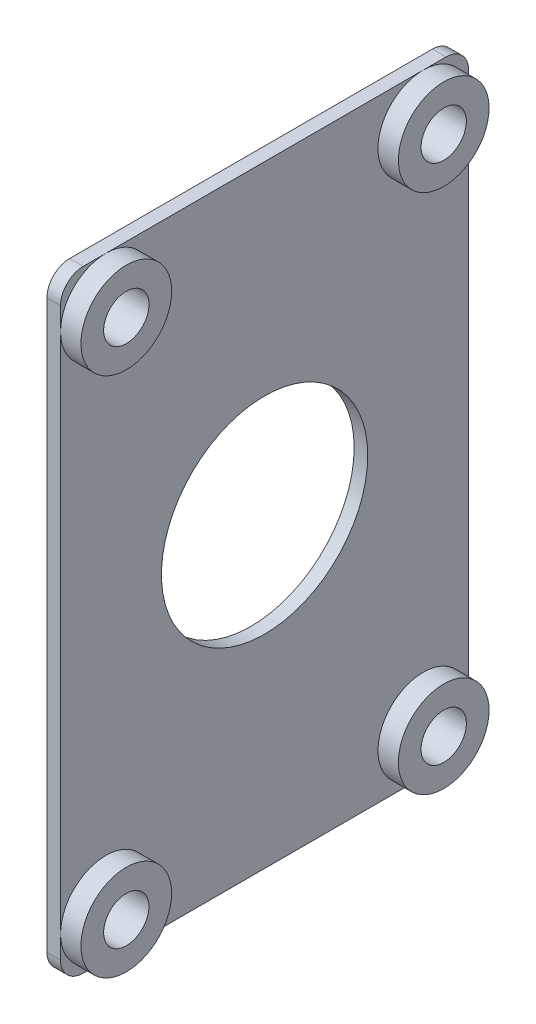
ISO-10303-21;
HEADER;
FILE_DESCRIPTION(('STEP AP214'),'2;1');
FILE_NAME('part.step','',(''),(''),'','','');
FILE_SCHEMA(('AUTOMOTIVE_DESIGN { 1 0 10303 214 1 1 1 1 }'));
ENDSEC;
DATA;
#1=APPLICATION_CONTEXT('core data for automotive mechanical design processes');
#2=APPLICATION_PROTOCOL_DEFINITION('international standard','automotive_design',2000,#1);
#3=PRODUCT_CONTEXT('',#1,'mechanical');
#4=PRODUCT('Part','Part','',(#3));
#5=PRODUCT_RELATED_PRODUCT_CATEGORY('part','',(#4));
#6=PRODUCT_DEFINITION_FORMATION('','',#4);
#7=PRODUCT_DEFINITION_CONTEXT('part definition',#1,'design');
#8=PRODUCT_DEFINITION('design','',#6,#7);
#9=PRODUCT_DEFINITION_SHAPE('','',#8);
#10=(LENGTH_UNIT() NAMED_UNIT(*) SI_UNIT(.MILLI.,.METRE.));
#11=(NAMED_UNIT(*) PLANE_ANGLE_UNIT() SI_UNIT($,.RADIAN.));
#12=(NAMED_UNIT(*) SI_UNIT($,.STERADIAN.) SOLID_ANGLE_UNIT());
#13=UNCERTAINTY_MEASURE_WITH_UNIT(LENGTH_MEASURE(1.E-05),#10,'distance_accuracy_value','');
#14=(GEOMETRIC_REPRESENTATION_CONTEXT(3) GLOBAL_UNCERTAINTY_ASSIGNED_CONTEXT((#13)) GLOBAL_UNIT_ASSIGNED_CONTEXT((#10,
#11,#12)) REPRESENTATION_CONTEXT('',''));
#15=CARTESIAN_POINT('',(0.,0.,0.));
#16=DIRECTION('',(0.,0.,1.));
#17=DIRECTION('',(1.,0.,0.));
#18=AXIS2_PLACEMENT_3D('',#15,#16,#17);
#19=CARTESIAN_POINT('',(-46.75,-23.,149.));
#20=DIRECTION('',(1.,0.,0.));
#21=DIRECTION('',(0.,0.,-1.));
#22=AXIS2_PLACEMENT_3D('',#19,#20,#21);
#23=CYLINDRICAL_SURFACE('',#22,4.);
#24=CARTESIAN_POINT('',(-43.75,-23.,149.));
#25=DIRECTION('',(1.,0.,0.));
#26=DIRECTION('',(0.,0.,-1.));
#27=AXIS2_PLACEMENT_3D('',#24,#25,#26);
#28=CIRCLE('',#27,4.);
#29=CARTESIAN_POINT('',(-43.75,-23.,145.));
#30=VERTEX_POINT('',#29);
#31=EDGE_CURVE('E122',#30,#30,#28,.T.);
#32=ORIENTED_EDGE('',*,*,#31,.F.);
#33=EDGE_LOOP('',(#32));
#34=FACE_BOUND('',#33,.T.);
#35=CARTESIAN_POINT('',(-45.55,-23.,149.));
#36=DIRECTION('',(1.,0.,0.));
#37=DIRECTION('',(0.,0.,-1.));
#38=AXIS2_PLACEMENT_3D('',#35,#36,#37);
#39=CIRCLE('',#38,4.);
#40=CARTESIAN_POINT('',(-45.55,-23.,145.));
#41=VERTEX_POINT('',#40);
#42=CARTESIAN_POINT('',(-45.55,-27.,149.));
#43=VERTEX_POINT('',#42);
#44=EDGE_CURVE('E221',#41,#43,#39,.F.);
#45=ORIENTED_EDGE('',*,*,#44,.F.);
#46=CARTESIAN_POINT('',(-45.55,-23.,149.));
#47=DIRECTION('',(1.,0.,0.));
#48=DIRECTION('',(0.,0.,-1.));
#49=AXIS2_PLACEMENT_3D('',#46,#47,#48);
#50=CIRCLE('',#49,4.);
#51=EDGE_CURVE('E214',#43,#41,#50,.F.);
#52=ORIENTED_EDGE('',*,*,#51,.F.);
#53=EDGE_LOOP('',(#45,#52));
#54=FACE_BOUND('',#53,.T.);
#55=ADVANCED_FACE('F16',(#34,#54),#23,.T.);
#56=CARTESIAN_POINT('',(-46.75,23.,149.));
#57=DIRECTION('',(1.,0.,0.));
#58=DIRECTION('',(0.,0.,-1.));
#59=AXIS2_PLACEMENT_3D('',#56,#57,#58);
#60=CYLINDRICAL_SURFACE('',#59,4.);
#61=CARTESIAN_POINT('',(-43.75,23.,149.));
#62=DIRECTION('',(1.,0.,0.));
#63=DIRECTION('',(0.,0.,-1.));
#64=AXIS2_PLACEMENT_3D('',#61,#62,#63);
#65=CIRCLE('',#64,4.);
#66=CARTESIAN_POINT('',(-43.75,23.,145.));
#67=VERTEX_POINT('',#66);
#68=EDGE_CURVE('E211',#67,#67,#65,.T.);
#69=ORIENTED_EDGE('',*,*,#68,.F.);
#70=EDGE_LOOP('',(#69));
#71=FACE_BOUND('',#70,.T.);
#72=CARTESIAN_POINT('',(-45.55,23.,149.));
#73=DIRECTION('',(1.,0.,0.));
#74=DIRECTION('',(0.,0.,-1.));
#75=AXIS2_PLACEMENT_3D('',#72,#73,#74);
#76=CIRCLE('',#75,4.);
#77=CARTESIAN_POINT('',(-45.55,23.,145.));
#78=VERTEX_POINT('',#77);
#79=CARTESIAN_POINT('',(-45.55,27.,149.));
#80=VERTEX_POINT('',#79);
#81=EDGE_CURVE('E111',#78,#80,#76,.F.);
#82=ORIENTED_EDGE('',*,*,#81,.F.);
#83=CARTESIAN_POINT('',(-45.55,23.,149.));
#84=DIRECTION('',(1.,0.,0.));
#85=DIRECTION('',(0.,0.,-1.));
#86=AXIS2_PLACEMENT_3D('',#83,#84,#85);
#87=CIRCLE('',#86,4.);
#88=EDGE_CURVE('E19',#80,#78,#87,.F.);
#89=ORIENTED_EDGE('',*,*,#88,.F.);
#90=EDGE_LOOP('',(#82,#89));
#91=FACE_BOUND('',#90,.T.);
#92=ADVANCED_FACE('F124',(#71,#91),#60,.T.);
#93=CARTESIAN_POINT('',(-46.75,-23.,177.));
#94=DIRECTION('',(1.,0.,0.));
#95=DIRECTION('',(0.,0.,-1.));
#96=AXIS2_PLACEMENT_3D('',#93,#94,#95);
#97=CYLINDRICAL_SURFACE('',#96,4.);
#98=CARTESIAN_POINT('',(-43.75,-23.,177.));
#99=DIRECTION('',(1.,0.,0.));
#100=DIRECTION('',(0.,0.,-1.));
#101=AXIS2_PLACEMENT_3D('',#98,#99,#100);
#102=CIRCLE('',#101,4.);
#103=CARTESIAN_POINT('',(-43.75,-23.,173.));
#104=VERTEX_POINT('',#103);
#105=EDGE_CURVE('E208',#104,#104,#102,.T.);
#106=ORIENTED_EDGE('',*,*,#105,.F.);
#107=EDGE_LOOP('',(#106));
#108=FACE_BOUND('',#107,.T.);
#109=CARTESIAN_POINT('',(-45.55,-23.,177.));
#110=DIRECTION('',(1.,0.,0.));
#111=DIRECTION('',(0.,0.,-1.));
#112=AXIS2_PLACEMENT_3D('',#109,#110,#111);
#113=CIRCLE('',#112,4.);
#114=CARTESIAN_POINT('',(-45.55,-27.,177.));
#115=VERTEX_POINT('',#114);
#116=CARTESIAN_POINT('',(-45.55,-23.,181.));
#117=VERTEX_POINT('',#116);
#118=EDGE_CURVE('E223',#115,#117,#113,.F.);
#119=ORIENTED_EDGE('',*,*,#118,.F.);
#120=CARTESIAN_POINT('',(-45.55,-23.,177.));
#121=DIRECTION('',(1.,0.,0.));
#122=DIRECTION('',(0.,0.,-1.));
#123=AXIS2_PLACEMENT_3D('',#120,#121,#122);
#124=CIRCLE('',#123,4.);
#125=EDGE_CURVE('E216',#117,#115,#124,.F.);
#126=ORIENTED_EDGE('',*,*,#125,.F.);
#127=EDGE_LOOP('',(#119,#126));
#128=FACE_BOUND('',#127,.T.);
#129=ADVANCED_FACE('F355',(#108,#128),#97,.T.);
#130=CARTESIAN_POINT('',(-46.75,23.,177.));
#131=DIRECTION('',(1.,0.,0.));
#132=DIRECTION('',(0.,0.,-1.));
#133=AXIS2_PLACEMENT_3D('',#130,#131,#132);
#134=CYLINDRICAL_SURFACE('',#133,4.);
#135=CARTESIAN_POINT('',(-43.75,23.,177.));
#136=DIRECTION('',(1.,0.,0.));
#137=DIRECTION('',(0.,0.,-1.));
#138=AXIS2_PLACEMENT_3D('',#135,#136,#137);
#139=CIRCLE('',#138,4.);
#140=CARTESIAN_POINT('',(-43.75,23.,173.));
#141=VERTEX_POINT('',#140);
#142=EDGE_CURVE('E205',#141,#141,#139,.T.);
#143=ORIENTED_EDGE('',*,*,#142,.F.);
#144=EDGE_LOOP('',(#143));
#145=FACE_BOUND('',#144,.T.);
#146=CARTESIAN_POINT('',(-45.55,23.,177.));
#147=DIRECTION('',(1.,0.,0.));
#148=DIRECTION('',(0.,0.,-1.));
#149=AXIS2_PLACEMENT_3D('',#146,#147,#148);
#150=CIRCLE('',#149,4.);
#151=CARTESIAN_POINT('',(-45.55,23.,181.));
#152=VERTEX_POINT('',#151);
#153=CARTESIAN_POINT('',(-45.55,27.,177.));
#154=VERTEX_POINT('',#153);
#155=EDGE_CURVE('E104',#152,#154,#150,.F.);
#156=ORIENTED_EDGE('',*,*,#155,.F.);
#157=CARTESIAN_POINT('',(-45.55,23.,177.));
#158=DIRECTION('',(1.,0.,0.));
#159=DIRECTION('',(0.,0.,-1.));
#160=AXIS2_PLACEMENT_3D('',#157,#158,#159);
#161=CIRCLE('',#160,4.);
#162=EDGE_CURVE('E121',#154,#152,#161,.F.);
#163=ORIENTED_EDGE('',*,*,#162,.F.);
#164=EDGE_LOOP('',(#156,#163));
#165=FACE_BOUND('',#164,.T.);
#166=ADVANCED_FACE('F352',(#145,#165),#134,.T.);
#167=CARTESIAN_POINT('',(-45.55,0.,163.));
#168=DIRECTION('',(1.,0.,0.));
#169=DIRECTION('',(0.,0.,-1.));
#170=AXIS2_PLACEMENT_3D('',#167,#168,#169);
#171=PLANE('',#170);
#172=CARTESIAN_POINT('',(-45.55,25.,147.));
#173=DIRECTION('',(1.,0.,0.));
#174=DIRECTION('',(0.,0.,-1.));
#175=AXIS2_PLACEMENT_3D('',#172,#173,#174);
#176=CIRCLE('',#175,2.);
#177=CARTESIAN_POINT('',(-45.55,27.,147.));
#178=VERTEX_POINT('',#177);
#179=CARTESIAN_POINT('',(-45.55,25.,145.));
#180=VERTEX_POINT('',#179);
#181=EDGE_CURVE('E138',#178,#180,#176,.F.);
#182=ORIENTED_EDGE('',*,*,#181,.F.);
#183=DIRECTION('',(0.,0.,-1.));
#184=VECTOR('',#183,1.);
#185=CARTESIAN_POINT('',(-45.55,27.,145.));
#186=LINE('',#185,#184);
#187=EDGE_CURVE('E133',#178,#80,#186,.F.);
#188=ORIENTED_EDGE('',*,*,#187,.T.);
#189=ORIENTED_EDGE('',*,*,#88,.T.);
#190=DIRECTION('',(0.,1.,0.));
#191=VECTOR('',#190,1.);
#192=CARTESIAN_POINT('',(-45.55,-27.,145.));
#193=LINE('',#192,#191);
#194=EDGE_CURVE('E145',#78,#180,#193,.T.);
#195=ORIENTED_EDGE('',*,*,#194,.T.);
#196=EDGE_LOOP('',(#182,#188,#189,#195));
#197=FACE_BOUND('',#196,.T.);
#198=ADVANCED_FACE('F137',(#197),#171,.T.);
#199=CARTESIAN_POINT('',(-45.55,0.,163.));
#200=DIRECTION('',(1.,0.,0.));
#201=DIRECTION('',(0.,0.,-1.));
#202=AXIS2_PLACEMENT_3D('',#199,#200,#201);
#203=PLANE('',#202);
#204=CARTESIAN_POINT('',(-45.55,25.,179.));
#205=DIRECTION('',(1.,0.,0.));
#206=DIRECTION('',(0.,0.,-1.));
#207=AXIS2_PLACEMENT_3D('',#204,#205,#206);
#208=CIRCLE('',#207,2.);
#209=CARTESIAN_POINT('',(-45.55,25.,181.));
#210=VERTEX_POINT('',#209);
#211=CARTESIAN_POINT('',(-45.55,27.,179.));
#212=VERTEX_POINT('',#211);
#213=EDGE_CURVE('E199',#210,#212,#208,.F.);
#214=ORIENTED_EDGE('',*,*,#213,.F.);
#215=DIRECTION('',(0.,1.,0.));
#216=VECTOR('',#215,1.);
#217=CARTESIAN_POINT('',(-45.55,27.,181.));
#218=LINE('',#217,#216);
#219=EDGE_CURVE('E243',#210,#152,#218,.F.);
#220=ORIENTED_EDGE('',*,*,#219,.T.);
#221=ORIENTED_EDGE('',*,*,#155,.T.);
#222=DIRECTION('',(0.,0.,-1.));
#223=VECTOR('',#222,1.);
#224=CARTESIAN_POINT('',(-45.55,27.,145.));
#225=LINE('',#224,#223);
#226=EDGE_CURVE('E135',#154,#212,#225,.F.);
#227=ORIENTED_EDGE('',*,*,#226,.T.);
#228=EDGE_LOOP('',(#214,#220,#221,#227));
#229=FACE_BOUND('',#228,.T.);
#230=ADVANCED_FACE('F248',(#229),#203,.T.);
#231=CARTESIAN_POINT('',(-45.55,0.,163.));
#232=DIRECTION('',(1.,0.,0.));
#233=DIRECTION('',(0.,0.,-1.));
#234=AXIS2_PLACEMENT_3D('',#231,#232,#233);
#235=PLANE('',#234);
#236=DIRECTION('',(0.,1.,0.));
#237=VECTOR('',#236,1.);
#238=CARTESIAN_POINT('',(-45.55,27.,181.));
#239=LINE('',#238,#237);
#240=CARTESIAN_POINT('',(-45.55,-25.,181.));
#241=VERTEX_POINT('',#240);
#242=EDGE_CURVE('E198',#117,#241,#239,.F.);
#243=ORIENTED_EDGE('',*,*,#242,.T.);
#244=CARTESIAN_POINT('',(-45.55,-25.,179.));
#245=DIRECTION('',(1.,0.,0.));
#246=DIRECTION('',(0.,0.,-1.));
#247=AXIS2_PLACEMENT_3D('',#244,#245,#246);
#248=CIRCLE('',#247,2.);
#249=CARTESIAN_POINT('',(-45.55,-27.,179.));
#250=VERTEX_POINT('',#249);
#251=EDGE_CURVE('E195',#250,#241,#248,.F.);
#252=ORIENTED_EDGE('',*,*,#251,.F.);
#253=DIRECTION('',(0.,0.,1.));
#254=VECTOR('',#253,1.);
#255=CARTESIAN_POINT('',(-45.55,-27.,181.));
#256=LINE('',#255,#254);
#257=EDGE_CURVE('E232',#250,#115,#256,.F.);
#258=ORIENTED_EDGE('',*,*,#257,.T.);
#259=ORIENTED_EDGE('',*,*,#118,.T.);
#260=EDGE_LOOP('',(#243,#252,#258,#259));
#261=FACE_BOUND('',#260,.T.);
#262=ADVANCED_FACE('F230',(#261),#235,.T.);
#263=CARTESIAN_POINT('',(-45.55,0.,163.));
#264=DIRECTION('',(1.,0.,0.));
#265=DIRECTION('',(0.,0.,-1.));
#266=AXIS2_PLACEMENT_3D('',#263,#264,#265);
#267=PLANE('',#266);
#268=ORIENTED_EDGE('',*,*,#44,.T.);
#269=DIRECTION('',(0.,0.,1.));
#270=VECTOR('',#269,1.);
#271=CARTESIAN_POINT('',(-45.55,-27.,181.));
#272=LINE('',#271,#270);
#273=CARTESIAN_POINT('',(-45.55,-27.,147.));
#274=VERTEX_POINT('',#273);
#275=EDGE_CURVE('E261',#43,#274,#272,.F.);
#276=ORIENTED_EDGE('',*,*,#275,.T.);
#277=CARTESIAN_POINT('',(-45.55,-25.,147.));
#278=DIRECTION('',(1.,0.,0.));
#279=DIRECTION('',(0.,0.,-1.));
#280=AXIS2_PLACEMENT_3D('',#277,#278,#279);
#281=CIRCLE('',#280,2.);
#282=CARTESIAN_POINT('',(-45.55,-25.,145.));
#283=VERTEX_POINT('',#282);
#284=EDGE_CURVE('E203',#283,#274,#281,.F.);
#285=ORIENTED_EDGE('',*,*,#284,.F.);
#286=DIRECTION('',(0.,1.,0.));
#287=VECTOR('',#286,1.);
#288=CARTESIAN_POINT('',(-45.55,-27.,145.));
#289=LINE('',#288,#287);
#290=EDGE_CURVE('E148',#283,#41,#289,.T.);
#291=ORIENTED_EDGE('',*,*,#290,.T.);
#292=EDGE_LOOP('',(#268,#276,#285,#291));
#293=FACE_BOUND('',#292,.T.);
#294=ADVANCED_FACE('F335',(#293),#267,.T.);
#295=CARTESIAN_POINT('',(-43.75,-23.,149.));
#296=DIRECTION('',(1.,0.,0.));
#297=DIRECTION('',(0.,0.,-1.));
#298=AXIS2_PLACEMENT_3D('',#295,#296,#297);
#299=PLANE('',#298);
#300=CARTESIAN_POINT('',(-43.75,-23.,149.));
#301=DIRECTION('',(1.,0.,0.));
#302=DIRECTION('',(0.,0.,-1.));
#303=AXIS2_PLACEMENT_3D('',#300,#301,#302);
#304=CIRCLE('',#303,2.);
#305=CARTESIAN_POINT('',(-43.75,-23.,147.));
#306=VERTEX_POINT('',#305);
#307=EDGE_CURVE('E191',#306,#306,#304,.F.);
#308=ORIENTED_EDGE('',*,*,#307,.T.);
#309=EDGE_LOOP('',(#308));
#310=FACE_BOUND('',#309,.T.);
#311=ORIENTED_EDGE('',*,*,#31,.T.);
#312=EDGE_LOOP('',(#311));
#313=FACE_BOUND('',#312,.T.);
#314=ADVANCED_FACE('F337',(#310,#313),#299,.T.);
#315=CARTESIAN_POINT('',(-45.55,0.,163.));
#316=DIRECTION('',(1.,0.,0.));
#317=DIRECTION('',(0.,0.,-1.));
#318=AXIS2_PLACEMENT_3D('',#315,#316,#317);
#319=PLANE('',#318);
#320=CARTESIAN_POINT('',(-45.55,0.,163.));
#321=DIRECTION('',(1.,0.,0.));
#322=DIRECTION('',(0.,0.,-1.));
#323=AXIS2_PLACEMENT_3D('',#320,#321,#322);
#324=CIRCLE('',#323,9.1);
#325=CARTESIAN_POINT('',(-45.55,0.,153.9));
#326=VERTEX_POINT('',#325);
#327=EDGE_CURVE('E188',#326,#326,#324,.F.);
#328=ORIENTED_EDGE('',*,*,#327,.T.);
#329=EDGE_LOOP('',(#328));
#330=FACE_BOUND('',#329,.T.);
#331=DIRECTION('',(0.,0.,1.));
#332=VECTOR('',#331,1.);
#333=CARTESIAN_POINT('',(-45.55,-27.,181.));
#334=LINE('',#333,#332);
#335=EDGE_CURVE('E264',#115,#43,#334,.F.);
#336=ORIENTED_EDGE('',*,*,#335,.T.);
#337=ORIENTED_EDGE('',*,*,#51,.T.);
#338=DIRECTION('',(0.,1.,0.));
#339=VECTOR('',#338,1.);
#340=CARTESIAN_POINT('',(-45.55,-27.,145.));
#341=LINE('',#340,#339);
#342=EDGE_CURVE('E118',#41,#78,#341,.T.);
#343=ORIENTED_EDGE('',*,*,#342,.T.);
#344=ORIENTED_EDGE('',*,*,#81,.T.);
#345=DIRECTION('',(0.,0.,-1.));
#346=VECTOR('',#345,1.);
#347=CARTESIAN_POINT('',(-45.55,27.,145.));
#348=LINE('',#347,#346);
#349=EDGE_CURVE('E116',#80,#154,#348,.F.);
#350=ORIENTED_EDGE('',*,*,#349,.T.);
#351=ORIENTED_EDGE('',*,*,#162,.T.);
#352=DIRECTION('',(0.,1.,0.));
#353=VECTOR('',#352,1.);
#354=CARTESIAN_POINT('',(-45.55,27.,181.));
#355=LINE('',#354,#353);
#356=EDGE_CURVE('E240',#152,#117,#355,.F.);
#357=ORIENTED_EDGE('',*,*,#356,.T.);
#358=ORIENTED_EDGE('',*,*,#125,.T.);
#359=EDGE_LOOP('',(#336,#337,#343,#344,#350,#351,#357,#358));
#360=FACE_BOUND('',#359,.T.);
#361=ADVANCED_FACE('F114',(#330,#360),#319,.T.);
#362=CARTESIAN_POINT('',(-43.75,23.,149.));
#363=DIRECTION('',(1.,0.,0.));
#364=DIRECTION('',(0.,0.,-1.));
#365=AXIS2_PLACEMENT_3D('',#362,#363,#364);
#366=PLANE('',#365);
#367=CARTESIAN_POINT('',(-43.75,23.,149.));
#368=DIRECTION('',(1.,0.,0.));
#369=DIRECTION('',(0.,0.,-1.));
#370=AXIS2_PLACEMENT_3D('',#367,#368,#369);
#371=CIRCLE('',#370,2.);
#372=CARTESIAN_POINT('',(-43.75,23.,147.));
#373=VERTEX_POINT('',#372);
#374=EDGE_CURVE('E185',#373,#373,#371,.F.);
#375=ORIENTED_EDGE('',*,*,#374,.T.);
#376=EDGE_LOOP('',(#375));
#377=FACE_BOUND('',#376,.T.);
#378=ORIENTED_EDGE('',*,*,#68,.T.);
#379=EDGE_LOOP('',(#378));
#380=FACE_BOUND('',#379,.T.);
#381=ADVANCED_FACE('F367',(#377,#380),#366,.T.);
#382=CARTESIAN_POINT('',(-43.75,-23.,177.));
#383=DIRECTION('',(1.,0.,0.));
#384=DIRECTION('',(0.,0.,-1.));
#385=AXIS2_PLACEMENT_3D('',#382,#383,#384);
#386=PLANE('',#385);
#387=CARTESIAN_POINT('',(-43.75,-23.,177.));
#388=DIRECTION('',(1.,0.,0.));
#389=DIRECTION('',(0.,0.,-1.));
#390=AXIS2_PLACEMENT_3D('',#387,#388,#389);
#391=CIRCLE('',#390,2.);
#392=CARTESIAN_POINT('',(-43.75,-23.,175.));
#393=VERTEX_POINT('',#392);
#394=EDGE_CURVE('E182',#393,#393,#391,.F.);
#395=ORIENTED_EDGE('',*,*,#394,.T.);
#396=EDGE_LOOP('',(#395));
#397=FACE_BOUND('',#396,.T.);
#398=ORIENTED_EDGE('',*,*,#105,.T.);
#399=EDGE_LOOP('',(#398));
#400=FACE_BOUND('',#399,.T.);
#401=ADVANCED_FACE('F369',(#397,#400),#386,.T.);
#402=CARTESIAN_POINT('',(-43.75,23.,177.));
#403=DIRECTION('',(1.,0.,0.));
#404=DIRECTION('',(0.,0.,-1.));
#405=AXIS2_PLACEMENT_3D('',#402,#403,#404);
#406=PLANE('',#405);
#407=CARTESIAN_POINT('',(-43.75,23.,177.));
#408=DIRECTION('',(1.,0.,0.));
#409=DIRECTION('',(0.,0.,-1.));
#410=AXIS2_PLACEMENT_3D('',#407,#408,#409);
#411=CIRCLE('',#410,2.);
#412=CARTESIAN_POINT('',(-43.75,23.,175.));
#413=VERTEX_POINT('',#412);
#414=EDGE_CURVE('E179',#413,#413,#411,.F.);
#415=ORIENTED_EDGE('',*,*,#414,.T.);
#416=EDGE_LOOP('',(#415));
#417=FACE_BOUND('',#416,.T.);
#418=ORIENTED_EDGE('',*,*,#142,.T.);
#419=EDGE_LOOP('',(#418));
#420=FACE_BOUND('',#419,.T.);
#421=ADVANCED_FACE('F376',(#417,#420),#406,.T.);
#422=CARTESIAN_POINT('',(-46.75,-25.,147.));
#423=DIRECTION('',(1.,0.,0.));
#424=DIRECTION('',(0.,0.,-1.));
#425=AXIS2_PLACEMENT_3D('',#422,#423,#424);
#426=CYLINDRICAL_SURFACE('',#425,2.);
#427=DIRECTION('',(1.,0.,0.));
#428=VECTOR('',#427,1.);
#429=CARTESIAN_POINT('',(-46.75,-27.,147.));
#430=LINE('',#429,#428);
#431=CARTESIAN_POINT('',(-46.75,-27.,147.));
#432=VERTEX_POINT('',#431);
#433=EDGE_CURVE('E194',#274,#432,#430,.F.);
#434=ORIENTED_EDGE('',*,*,#433,.T.);
#435=CARTESIAN_POINT('',(-46.75,-25.,147.));
#436=DIRECTION('',(1.,0.,0.));
#437=DIRECTION('',(0.,0.,-1.));
#438=AXIS2_PLACEMENT_3D('',#435,#436,#437);
#439=CIRCLE('',#438,2.);
#440=CARTESIAN_POINT('',(-46.75,-25.,145.));
#441=VERTEX_POINT('',#440);
#442=EDGE_CURVE('E176',#432,#441,#439,.T.);
#443=ORIENTED_EDGE('',*,*,#442,.T.);
#444=DIRECTION('',(1.,0.,0.));
#445=VECTOR('',#444,1.);
#446=CARTESIAN_POINT('',(-46.75,-25.,145.));
#447=LINE('',#446,#445);
#448=EDGE_CURVE('E150',#441,#283,#447,.T.);
#449=ORIENTED_EDGE('',*,*,#448,.T.);
#450=ORIENTED_EDGE('',*,*,#284,.T.);
#451=EDGE_LOOP('',(#434,#443,#449,#450));
#452=FACE_BOUND('',#451,.T.);
#453=ADVANCED_FACE('F273',(#452),#426,.T.);
#454=CARTESIAN_POINT('',(-46.75,-27.,145.));
#455=DIRECTION('',(0.,0.,1.));
#456=DIRECTION('',(1.,0.,0.));
#457=AXIS2_PLACEMENT_3D('',#454,#455,#456);
#458=PLANE('',#457);
#459=ORIENTED_EDGE('',*,*,#194,.F.);
#460=ORIENTED_EDGE('',*,*,#342,.F.);
#461=ORIENTED_EDGE('',*,*,#290,.F.);
#462=ORIENTED_EDGE('',*,*,#448,.F.);
#463=DIRECTION('',(0.,1.,0.));
#464=VECTOR('',#463,1.);
#465=CARTESIAN_POINT('',(-46.75,0.,145.));
#466=LINE('',#465,#464);
#467=CARTESIAN_POINT('',(-46.75,25.,145.));
#468=VERTEX_POINT('',#467);
#469=EDGE_CURVE('E175',#441,#468,#466,.T.);
#470=ORIENTED_EDGE('',*,*,#469,.T.);
#471=DIRECTION('',(1.,0.,0.));
#472=VECTOR('',#471,1.);
#473=CARTESIAN_POINT('',(-46.75,25.,145.));
#474=LINE('',#473,#472);
#475=EDGE_CURVE('E141',#180,#468,#474,.F.);
#476=ORIENTED_EDGE('',*,*,#475,.F.);
#477=EDGE_LOOP('',(#459,#460,#461,#462,#470,#476));
#478=FACE_BOUND('',#477,.T.);
#479=ADVANCED_FACE('F333',(#478),#458,.F.);
#480=CARTESIAN_POINT('',(-46.75,25.,147.));
#481=DIRECTION('',(1.,0.,0.));
#482=DIRECTION('',(0.,0.,-1.));
#483=AXIS2_PLACEMENT_3D('',#480,#481,#482);
#484=CYLINDRICAL_SURFACE('',#483,2.);
#485=ORIENTED_EDGE('',*,*,#181,.T.);
#486=ORIENTED_EDGE('',*,*,#475,.T.);
#487=CARTESIAN_POINT('',(-46.75,25.,147.));
#488=DIRECTION('',(1.,0.,0.));
#489=DIRECTION('',(0.,0.,-1.));
#490=AXIS2_PLACEMENT_3D('',#487,#488,#489);
#491=CIRCLE('',#490,2.);
#492=CARTESIAN_POINT('',(-46.75,27.,147.));
#493=VERTEX_POINT('',#492);
#494=EDGE_CURVE('E172',#468,#493,#491,.T.);
#495=ORIENTED_EDGE('',*,*,#494,.T.);
#496=DIRECTION('',(1.,0.,0.));
#497=VECTOR('',#496,1.);
#498=CARTESIAN_POINT('',(-46.75,27.,147.));
#499=LINE('',#498,#497);
#500=EDGE_CURVE('E139',#493,#178,#499,.T.);
#501=ORIENTED_EDGE('',*,*,#500,.T.);
#502=EDGE_LOOP('',(#485,#486,#495,#501));
#503=FACE_BOUND('',#502,.T.);
#504=ADVANCED_FACE('F292',(#503),#484,.T.);
#505=CARTESIAN_POINT('',(-46.75,27.,145.));
#506=DIRECTION('',(0.,-1.,0.));
#507=DIRECTION('',(0.,0.,-1.));
#508=AXIS2_PLACEMENT_3D('',#505,#506,#507);
#509=PLANE('',#508);
#510=DIRECTION('',(1.,0.,0.));
#511=VECTOR('',#510,1.);
#512=CARTESIAN_POINT('',(-46.75,27.,179.));
#513=LINE('',#512,#511);
#514=CARTESIAN_POINT('',(-46.75,27.,179.));
#515=VERTEX_POINT('',#514);
#516=EDGE_CURVE('E201',#212,#515,#513,.F.);
#517=ORIENTED_EDGE('',*,*,#516,.F.);
#518=ORIENTED_EDGE('',*,*,#226,.F.);
#519=ORIENTED_EDGE('',*,*,#349,.F.);
#520=ORIENTED_EDGE('',*,*,#187,.F.);
#521=ORIENTED_EDGE('',*,*,#500,.F.);
#522=DIRECTION('',(0.,0.,-1.));
#523=VECTOR('',#522,1.);
#524=CARTESIAN_POINT('',(-46.75,27.,163.));
#525=LINE('',#524,#523);
#526=EDGE_CURVE('E171',#493,#515,#525,.F.);
#527=ORIENTED_EDGE('',*,*,#526,.T.);
#528=EDGE_LOOP('',(#517,#518,#519,#520,#521,#527));
#529=FACE_BOUND('',#528,.T.);
#530=ADVANCED_FACE('F132',(#529),#509,.F.);
#531=CARTESIAN_POINT('',(-46.75,25.,179.));
#532=DIRECTION('',(1.,0.,0.));
#533=DIRECTION('',(0.,0.,-1.));
#534=AXIS2_PLACEMENT_3D('',#531,#532,#533);
#535=CYLINDRICAL_SURFACE('',#534,2.);
#536=ORIENTED_EDGE('',*,*,#213,.T.);
#537=ORIENTED_EDGE('',*,*,#516,.T.);
#538=CARTESIAN_POINT('',(-46.75,25.,179.));
#539=DIRECTION('',(1.,0.,0.));
#540=DIRECTION('',(0.,0.,-1.));
#541=AXIS2_PLACEMENT_3D('',#538,#539,#540);
#542=CIRCLE('',#541,2.);
#543=CARTESIAN_POINT('',(-46.75,25.,181.));
#544=VERTEX_POINT('',#543);
#545=EDGE_CURVE('E168',#515,#544,#542,.T.);
#546=ORIENTED_EDGE('',*,*,#545,.T.);
#547=DIRECTION('',(-1.,0.,0.));
#548=VECTOR('',#547,1.);
#549=CARTESIAN_POINT('',(-46.75,25.,181.));
#550=LINE('',#549,#548);
#551=EDGE_CURVE('E245',#544,#210,#550,.F.);
#552=ORIENTED_EDGE('',*,*,#551,.T.);
#553=EDGE_LOOP('',(#536,#537,#546,#552));
#554=FACE_BOUND('',#553,.T.);
#555=ADVANCED_FACE('F282',(#554),#535,.T.);
#556=CARTESIAN_POINT('',(-46.75,27.,181.));
#557=DIRECTION('',(0.,0.,-1.));
#558=DIRECTION('',(-1.,0.,0.));
#559=AXIS2_PLACEMENT_3D('',#556,#557,#558);
#560=PLANE('',#559);
#561=DIRECTION('',(1.,0.,0.));
#562=VECTOR('',#561,1.);
#563=CARTESIAN_POINT('',(-46.75,-25.,181.));
#564=LINE('',#563,#562);
#565=CARTESIAN_POINT('',(-46.75,-25.,181.));
#566=VERTEX_POINT('',#565);
#567=EDGE_CURVE('E197',#241,#566,#564,.F.);
#568=ORIENTED_EDGE('',*,*,#567,.F.);
#569=ORIENTED_EDGE('',*,*,#242,.F.);
#570=ORIENTED_EDGE('',*,*,#356,.F.);
#571=ORIENTED_EDGE('',*,*,#219,.F.);
#572=ORIENTED_EDGE('',*,*,#551,.F.);
#573=DIRECTION('',(0.,1.,0.));
#574=VECTOR('',#573,1.);
#575=CARTESIAN_POINT('',(-46.75,0.,181.));
#576=LINE('',#575,#574);
#577=EDGE_CURVE('E167',#544,#566,#576,.F.);
#578=ORIENTED_EDGE('',*,*,#577,.T.);
#579=EDGE_LOOP('',(#568,#569,#570,#571,#572,#578));
#580=FACE_BOUND('',#579,.T.);
#581=ADVANCED_FACE('F238',(#580),#560,.F.);
#582=CARTESIAN_POINT('',(-46.75,-25.,179.));
#583=DIRECTION('',(1.,0.,0.));
#584=DIRECTION('',(0.,0.,-1.));
#585=AXIS2_PLACEMENT_3D('',#582,#583,#584);
#586=CYLINDRICAL_SURFACE('',#585,2.);
#587=ORIENTED_EDGE('',*,*,#251,.T.);
#588=ORIENTED_EDGE('',*,*,#567,.T.);
#589=CARTESIAN_POINT('',(-46.75,-25.,179.));
#590=DIRECTION('',(1.,0.,0.));
#591=DIRECTION('',(0.,0.,-1.));
#592=AXIS2_PLACEMENT_3D('',#589,#590,#591);
#593=CIRCLE('',#592,2.);
#594=CARTESIAN_POINT('',(-46.75,-27.,179.));
#595=VERTEX_POINT('',#594);
#596=EDGE_CURVE('E164',#566,#595,#593,.T.);
#597=ORIENTED_EDGE('',*,*,#596,.T.);
#598=DIRECTION('',(1.,0.,0.));
#599=VECTOR('',#598,1.);
#600=CARTESIAN_POINT('',(-46.75,-27.,179.));
#601=LINE('',#600,#599);
#602=EDGE_CURVE('E34',#595,#250,#601,.T.);
#603=ORIENTED_EDGE('',*,*,#602,.T.);
#604=EDGE_LOOP('',(#587,#588,#597,#603));
#605=FACE_BOUND('',#604,.T.);
#606=ADVANCED_FACE('F290',(#605),#586,.T.);
#607=CARTESIAN_POINT('',(-46.75,-27.,181.));
#608=DIRECTION('',(0.,1.,0.));
#609=DIRECTION('',(0.,0.,1.));
#610=AXIS2_PLACEMENT_3D('',#607,#608,#609);
#611=PLANE('',#610);
#612=ORIENTED_EDGE('',*,*,#275,.F.);
#613=ORIENTED_EDGE('',*,*,#335,.F.);
#614=ORIENTED_EDGE('',*,*,#257,.F.);
#615=ORIENTED_EDGE('',*,*,#602,.F.);
#616=DIRECTION('',(0.,0.,-1.));
#617=VECTOR('',#616,1.);
#618=CARTESIAN_POINT('',(-46.75,-27.,163.));
#619=LINE('',#618,#617);
#620=EDGE_CURVE('E163',#595,#432,#619,.T.);
#621=ORIENTED_EDGE('',*,*,#620,.T.);
#622=ORIENTED_EDGE('',*,*,#433,.F.);
#623=EDGE_LOOP('',(#612,#613,#614,#615,#621,#622));
#624=FACE_BOUND('',#623,.T.);
#625=ADVANCED_FACE('F275',(#624),#611,.F.);
#626=CARTESIAN_POINT('',(-47.25,-23.,149.));
#627=DIRECTION('',(1.,0.,0.));
#628=DIRECTION('',(0.,0.,-1.));
#629=AXIS2_PLACEMENT_3D('',#626,#627,#628);
#630=CYLINDRICAL_SURFACE('',#629,2.);
#631=CARTESIAN_POINT('',(-46.75,-23.,149.));
#632=DIRECTION('',(1.,0.,0.));
#633=DIRECTION('',(0.,0.,-1.));
#634=AXIS2_PLACEMENT_3D('',#631,#632,#633);
#635=CIRCLE('',#634,2.);
#636=CARTESIAN_POINT('',(-46.75,-23.,147.));
#637=VERTEX_POINT('',#636);
#638=EDGE_CURVE('E160',#637,#637,#635,.F.);
#639=ORIENTED_EDGE('',*,*,#638,.T.);
#640=EDGE_LOOP('',(#639));
#641=FACE_BOUND('',#640,.T.);
#642=ORIENTED_EDGE('',*,*,#307,.F.);
#643=EDGE_LOOP('',(#642));
#644=FACE_BOUND('',#643,.T.);
#645=ADVANCED_FACE('F317',(#641,#644),#630,.F.);
#646=CARTESIAN_POINT('',(-48.55,0.,163.));
#647=DIRECTION('',(1.,0.,0.));
#648=DIRECTION('',(0.,0.,-1.));
#649=AXIS2_PLACEMENT_3D('',#646,#647,#648);
#650=CYLINDRICAL_SURFACE('',#649,9.1);
#651=CARTESIAN_POINT('',(-46.75,0.,163.));
#652=DIRECTION('',(1.,0.,0.));
#653=DIRECTION('',(0.,0.,-1.));
#654=AXIS2_PLACEMENT_3D('',#651,#652,#653);
#655=CIRCLE('',#654,9.1);
#656=CARTESIAN_POINT('',(-46.75,0.,153.9));
#657=VERTEX_POINT('',#656);
#658=EDGE_CURVE('E157',#657,#657,#655,.F.);
#659=ORIENTED_EDGE('',*,*,#658,.T.);
#660=EDGE_LOOP('',(#659));
#661=FACE_BOUND('',#660,.T.);
#662=ORIENTED_EDGE('',*,*,#327,.F.);
#663=EDGE_LOOP('',(#662));
#664=FACE_BOUND('',#663,.T.);
#665=ADVANCED_FACE('F313',(#661,#664),#650,.F.);
#666=CARTESIAN_POINT('',(-47.25,23.,149.));
#667=DIRECTION('',(1.,0.,0.));
#668=DIRECTION('',(0.,0.,-1.));
#669=AXIS2_PLACEMENT_3D('',#666,#667,#668);
#670=CYLINDRICAL_SURFACE('',#669,2.);
#671=CARTESIAN_POINT('',(-46.75,23.,149.));
#672=DIRECTION('',(1.,0.,0.));
#673=DIRECTION('',(0.,0.,-1.));
#674=AXIS2_PLACEMENT_3D('',#671,#672,#673);
#675=CIRCLE('',#674,2.);
#676=CARTESIAN_POINT('',(-46.75,23.,147.));
#677=VERTEX_POINT('',#676);
#678=EDGE_CURVE('E154',#677,#677,#675,.F.);
#679=ORIENTED_EDGE('',*,*,#678,.T.);
#680=EDGE_LOOP('',(#679));
#681=FACE_BOUND('',#680,.T.);
#682=ORIENTED_EDGE('',*,*,#374,.F.);
#683=EDGE_LOOP('',(#682));
#684=FACE_BOUND('',#683,.T.);
#685=ADVANCED_FACE('F309',(#681,#684),#670,.F.);
#686=CARTESIAN_POINT('',(-47.25,-23.,177.));
#687=DIRECTION('',(1.,0.,0.));
#688=DIRECTION('',(0.,0.,-1.));
#689=AXIS2_PLACEMENT_3D('',#686,#687,#688);
#690=CYLINDRICAL_SURFACE('',#689,2.);
#691=CARTESIAN_POINT('',(-46.75,-23.,177.));
#692=DIRECTION('',(1.,0.,0.));
#693=DIRECTION('',(0.,0.,-1.));
#694=AXIS2_PLACEMENT_3D('',#691,#692,#693);
#695=CIRCLE('',#694,2.);
#696=CARTESIAN_POINT('',(-46.75,-23.,175.));
#697=VERTEX_POINT('',#696);
#698=EDGE_CURVE('E25',#697,#697,#695,.F.);
#699=ORIENTED_EDGE('',*,*,#698,.T.);
#700=EDGE_LOOP('',(#699));
#701=FACE_BOUND('',#700,.T.);
#702=ORIENTED_EDGE('',*,*,#394,.F.);
#703=EDGE_LOOP('',(#702));
#704=FACE_BOUND('',#703,.T.);
#705=ADVANCED_FACE('F301',(#701,#704),#690,.F.);
#706=CARTESIAN_POINT('',(-47.25,23.,177.));
#707=DIRECTION('',(1.,0.,0.));
#708=DIRECTION('',(0.,0.,-1.));
#709=AXIS2_PLACEMENT_3D('',#706,#707,#708);
#710=CYLINDRICAL_SURFACE('',#709,2.);
#711=CARTESIAN_POINT('',(-46.75,23.,177.));
#712=DIRECTION('',(1.,0.,0.));
#713=DIRECTION('',(0.,0.,-1.));
#714=AXIS2_PLACEMENT_3D('',#711,#712,#713);
#715=CIRCLE('',#714,2.);
#716=CARTESIAN_POINT('',(-46.75,23.,175.));
#717=VERTEX_POINT('',#716);
#718=EDGE_CURVE('E10',#717,#717,#715,.F.);
#719=ORIENTED_EDGE('',*,*,#718,.T.);
#720=EDGE_LOOP('',(#719));
#721=FACE_BOUND('',#720,.T.);
#722=ORIENTED_EDGE('',*,*,#414,.F.);
#723=EDGE_LOOP('',(#722));
#724=FACE_BOUND('',#723,.T.);
#725=ADVANCED_FACE('F295',(#721,#724),#710,.F.);
#726=CARTESIAN_POINT('',(-46.75,0.,163.));
#727=DIRECTION('',(1.,0.,0.));
#728=DIRECTION('',(0.,0.,-1.));
#729=AXIS2_PLACEMENT_3D('',#726,#727,#728);
#730=PLANE('',#729);
#731=ORIENTED_EDGE('',*,*,#718,.F.);
#732=EDGE_LOOP('',(#731));
#733=FACE_BOUND('',#732,.T.);
#734=ORIENTED_EDGE('',*,*,#698,.F.);
#735=EDGE_LOOP('',(#734));
#736=FACE_BOUND('',#735,.T.);
#737=ORIENTED_EDGE('',*,*,#678,.F.);
#738=EDGE_LOOP('',(#737));
#739=FACE_BOUND('',#738,.T.);
#740=ORIENTED_EDGE('',*,*,#658,.F.);
#741=EDGE_LOOP('',(#740));
#742=FACE_BOUND('',#741,.T.);
#743=ORIENTED_EDGE('',*,*,#638,.F.);
#744=EDGE_LOOP('',(#743));
#745=FACE_BOUND('',#744,.T.);
#746=ORIENTED_EDGE('',*,*,#596,.F.);
#747=ORIENTED_EDGE('',*,*,#577,.F.);
#748=ORIENTED_EDGE('',*,*,#545,.F.);
#749=ORIENTED_EDGE('',*,*,#526,.F.);
#750=ORIENTED_EDGE('',*,*,#494,.F.);
#751=ORIENTED_EDGE('',*,*,#469,.F.);
#752=ORIENTED_EDGE('',*,*,#442,.F.);
#753=ORIENTED_EDGE('',*,*,#620,.F.);
#754=EDGE_LOOP('',(#746,#747,#748,#749,#750,#751,#752,#753));
#755=FACE_BOUND('',#754,.T.);
#756=ADVANCED_FACE('F281',(#733,#736,#739,#742,#745,#755),#730,.F.);
#757=CLOSED_SHELL('',(#55,#92,#129,#166,#198,#230,#262,#294,#314,#361,#381,#401,#421,#453,#479,
#504,#530,#555,#581,#606,#625,#645,#665,#685,#705,#725,#756));
#758=MANIFOLD_SOLID_BREP('B1',#757);
#759=ADVANCED_BREP_SHAPE_REPRESENTATION('',(#18,#758),#14);
#760=SHAPE_DEFINITION_REPRESENTATION(#9,#759);
ENDSEC;
END-ISO-10303-21;
